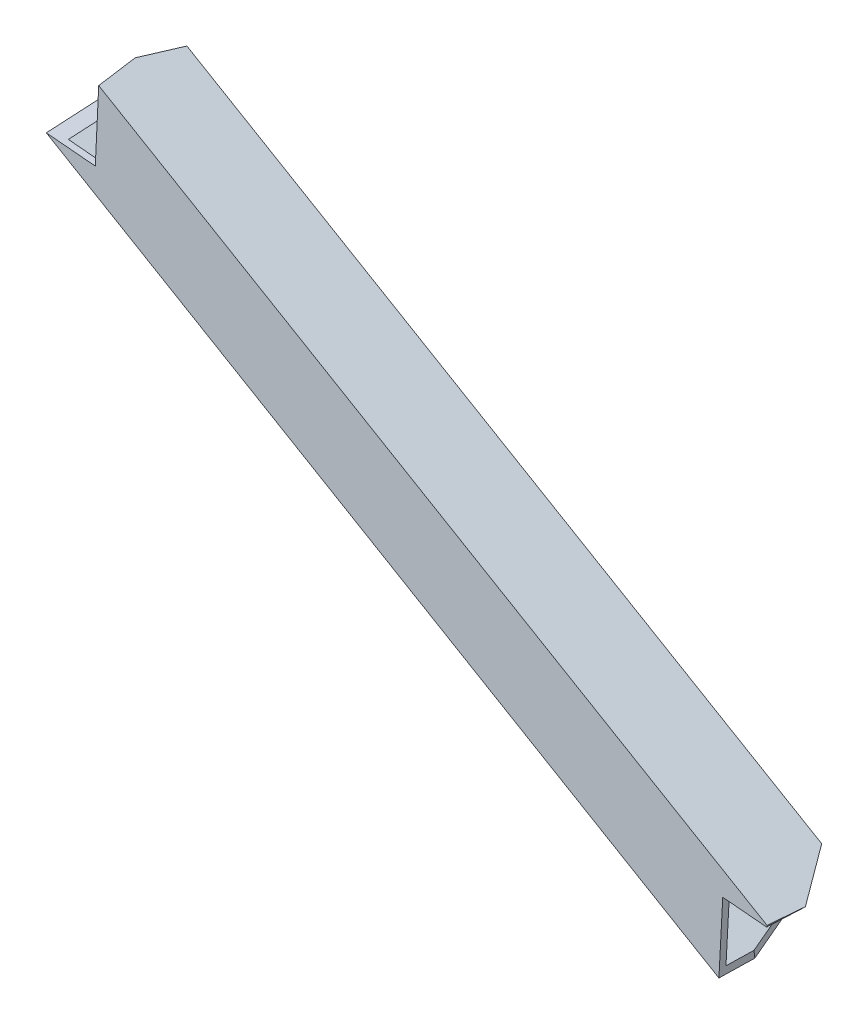
ISO-10303-21;
HEADER;
FILE_DESCRIPTION(('STEP AP214'),'2;1');
FILE_NAME('part.step','',(''),(''),'','','');
FILE_SCHEMA(('AUTOMOTIVE_DESIGN { 1 0 10303 214 1 1 1 1 }'));
ENDSEC;
DATA;
#1=APPLICATION_CONTEXT('core data for automotive mechanical design processes');
#2=APPLICATION_PROTOCOL_DEFINITION('international standard','automotive_design',2000,#1);
#3=PRODUCT_CONTEXT('',#1,'mechanical');
#4=PRODUCT('Part','Part','',(#3));
#5=PRODUCT_RELATED_PRODUCT_CATEGORY('part','',(#4));
#6=PRODUCT_DEFINITION_FORMATION('','',#4);
#7=PRODUCT_DEFINITION_CONTEXT('part definition',#1,'design');
#8=PRODUCT_DEFINITION('design','',#6,#7);
#9=PRODUCT_DEFINITION_SHAPE('','',#8);
#10=(LENGTH_UNIT() NAMED_UNIT(*) SI_UNIT(.MILLI.,.METRE.));
#11=(NAMED_UNIT(*) PLANE_ANGLE_UNIT() SI_UNIT($,.RADIAN.));
#12=(NAMED_UNIT(*) SI_UNIT($,.STERADIAN.) SOLID_ANGLE_UNIT());
#13=UNCERTAINTY_MEASURE_WITH_UNIT(LENGTH_MEASURE(1.E-05),#10,'distance_accuracy_value','');
#14=(GEOMETRIC_REPRESENTATION_CONTEXT(3) GLOBAL_UNCERTAINTY_ASSIGNED_CONTEXT((#13)) GLOBAL_UNIT_ASSIGNED_CONTEXT((#10,
#11,#12)) REPRESENTATION_CONTEXT('',''));
#15=CARTESIAN_POINT('',(0.,0.,0.));
#16=DIRECTION('',(0.,0.,1.));
#17=DIRECTION('',(1.,0.,0.));
#18=AXIS2_PLACEMENT_3D('',#15,#16,#17);
#19=CARTESIAN_POINT('',(-63.0871154005148,-89.7690510930017,-1689.74860806712));
#20=DIRECTION('',(0.389788086231143,0.920681692103509,-0.0202600507818227));
#21=DIRECTION('',(-0.920870706243423,0.389868108958324,0.));
#22=AXIS2_PLACEMENT_3D('',#19,#20,#21);
#23=PLANE('',#22);
#24=DIRECTION('',(0.0519070217012584,0.,0.99865192189176));
#25=VECTOR('',#24,1.);
#26=CARTESIAN_POINT('',(-250.99441719747,-10.,-1679.98173316467));
#27=LINE('',#26,#25);
#28=CARTESIAN_POINT('',(-252.538611746394,-10.,-1709.69087084037));
#29=VERTEX_POINT('',#28);
#30=CARTESIAN_POINT('',(-251.489530353145,-9.99999999999999,-1689.50733660452));
#31=VERTEX_POINT('',#30);
#32=EDGE_CURVE('E11',#29,#31,#27,.T.);
#33=ORIENTED_EDGE('',*,*,#32,.F.);
#34=DIRECTION('',(-0.917328644212009,0.386243639668214,-0.0965609099170536));
#35=VECTOR('',#34,1.);
#36=CARTESIAN_POINT('',(-63.0871154005148,-89.7690510930017,-1689.74860806712));
#37=LINE('',#36,#35);
#38=CARTESIAN_POINT('',(-74.1970478620124,-85.0911847934237,-1690.91807464201));
#39=VERTEX_POINT('',#38);
#40=EDGE_CURVE('E109',#39,#29,#37,.T.);
#41=ORIENTED_EDGE('',*,*,#40,.F.);
#42=DIRECTION('',(-0.331543273132427,0.119772265723642,-0.935806423574909));
#43=VECTOR('',#42,1.);
#44=CARTESIAN_POINT('',(-72.4272379255188,-85.7305406880294,-1685.92264978712));
#45=LINE('',#44,#43);
#46=CARTESIAN_POINT('',(-70.0000000000002,-86.6073969217361,-1679.07158379871));
#47=VERTEX_POINT('',#46);
#48=EDGE_CURVE('E293',#47,#39,#45,.T.);
#49=ORIENTED_EDGE('',*,*,#48,.F.);
#50=DIRECTION('',(0.,-0.0220001628763165,-0.999757967126752));
#51=VECTOR('',#50,1.);
#52=CARTESIAN_POINT('',(-70.0000000000002,-86.8437666053328,-1689.81298038252));
#53=LINE('',#52,#51);
#54=CARTESIAN_POINT('',(-70.0000000000002,-86.416644359219,-1670.40317551471));
#55=VERTEX_POINT('',#54);
#56=EDGE_CURVE('E167',#55,#47,#53,.T.);
#57=ORIENTED_EDGE('',*,*,#56,.F.);
#58=DIRECTION('',(-0.917328644212009,0.386243639668214,-0.0965609099170536));
#59=VECTOR('',#58,1.);
#60=CARTESIAN_POINT('',(-64.7086463241079,-88.6445827490684,-1669.84619091725));
#61=LINE('',#60,#59);
#62=EDGE_CURVE('E45',#55,#31,#61,.T.);
#63=ORIENTED_EDGE('',*,*,#62,.T.);
#64=EDGE_LOOP('',(#33,#41,#49,#57,#63));
#65=FACE_BOUND('',#64,.T.);
#66=ADVANCED_FACE('F41',(#65),#23,.F.);
#67=CARTESIAN_POINT('',(-56.9128845994852,-70.2309489069982,-1670.25139193288));
#68=DIRECTION('',(0.0810765461796534,-0.056223417196662,-0.995120857493354));
#69=DIRECTION('',(-0.996697420861703,0.,-0.0812049952135336));
#70=AXIS2_PLACEMENT_3D('',#67,#68,#69);
#71=PLANE('',#70);
#72=DIRECTION('',(-0.00650701564536868,0.998356602920274,-0.056936386896976));
#73=VECTOR('',#72,1.);
#74=CARTESIAN_POINT('',(-238.210154803049,-72.2484874476755,-1684.90842929572));
#75=LINE('',#74,#73);
#76=CARTESIAN_POINT('',(-238.615873441598,-10.,-1688.45846738302));
#77=VERTEX_POINT('',#76);
#78=CARTESIAN_POINT('',(-238.722245095367,6.32036077547827,-1689.3892193535));
#79=VERTEX_POINT('',#78);
#80=EDGE_CURVE('E103',#77,#79,#75,.T.);
#81=ORIENTED_EDGE('',*,*,#80,.F.);
#82=DIRECTION('',(0.996697420861703,0.,0.0812049952135336));
#83=VECTOR('',#82,1.);
#84=CARTESIAN_POINT('',(-56.6374571669114,-10.,-1673.63194519761));
#85=LINE('',#84,#83);
#86=EDGE_CURVE('E128',#31,#77,#85,.T.);
#87=ORIENTED_EDGE('',*,*,#86,.F.);
#88=ORIENTED_EDGE('',*,*,#62,.F.);
#89=DIRECTION('',(0.,-0.998407737776047,0.0564091229227733));
#90=VECTOR('',#89,1.);
#91=CARTESIAN_POINT('',(-70.0000000000002,-70.2909999601044,-1671.31425965669));
#92=LINE('',#91,#90);
#93=CARTESIAN_POINT('',(-70.0000000000002,-69.9999999999998,-1671.33070088796));
#94=VERTEX_POINT('',#93);
#95=EDGE_CURVE('E173',#94,#55,#92,.T.);
#96=ORIENTED_EDGE('',*,*,#95,.F.);
#97=DIRECTION('',(-0.996697420861703,0.,-0.0812049952135336));
#98=VECTOR('',#97,1.);
#99=CARTESIAN_POINT('',(-56.9118285034804,-69.9999999999998,-1670.26435429021));
#100=LINE('',#99,#98);
#101=CARTESIAN_POINT('',(-58.4694290318394,-69.9999999999998,-1670.39125834434));
#102=VERTEX_POINT('',#101);
#103=EDGE_CURVE('E247',#102,#94,#100,.T.);
#104=ORIENTED_EDGE('',*,*,#103,.F.);
#105=DIRECTION('',(-0.199222248814033,-0.97917434035687,0.0390910061800458));
#106=VECTOR('',#105,1.);
#107=CARTESIAN_POINT('',(-58.4537917747577,-69.9231431179037,-1670.39432665682));
#108=LINE('',#107,#106);
#109=CARTESIAN_POINT('',(-58.389887195482,-69.6090530771048,-1670.40686589036));
#110=VERTEX_POINT('',#109);
#111=EDGE_CURVE('E254',#110,#102,#108,.T.);
#112=ORIENTED_EDGE('',*,*,#111,.F.);
#113=DIRECTION('',(-0.917328644212009,0.386243639668214,-0.0965609099170536));
#114=VECTOR('',#113,1.);
#115=CARTESIAN_POINT('',(-56.9128845994852,-70.2309489069982,-1670.25139193288));
#116=LINE('',#115,#114);
#117=EDGE_CURVE('E152',#110,#79,#116,.T.);
#118=ORIENTED_EDGE('',*,*,#117,.T.);
#119=EDGE_LOOP('',(#81,#87,#88,#96,#104,#112,#118));
#120=FACE_BOUND('',#119,.T.);
#121=ADVANCED_FACE('F169',(#120),#71,.F.);
#122=CARTESIAN_POINT('',(-55.2913536758921,-71.3554172509315,-1690.15380908275));
#123=DIRECTION('',(-0.389788086231143,-0.920681692103509,0.0202600507818227));
#124=DIRECTION('',(0.920870706243423,-0.389868108958324,0.));
#125=AXIS2_PLACEMENT_3D('',#122,#123,#124);
#126=PLANE('',#125);
#127=DIRECTION('',(-0.113507613195636,0.0261999374612772,-0.993191615461818));
#128=VECTOR('',#127,1.);
#129=CARTESIAN_POINT('',(-236.214121953579,5.74143335721979,-1667.44314186286));
#130=LINE('',#129,#128);
#131=CARTESIAN_POINT('',(-239.858774037238,6.58269548908574,-1699.33384759487));
#132=VERTEX_POINT('',#131);
#133=EDGE_CURVE('E119',#79,#132,#130,.T.);
#134=ORIENTED_EDGE('',*,*,#133,.F.);
#135=ORIENTED_EDGE('',*,*,#117,.F.);
#136=DIRECTION('',(-0.0422484460755079,0.039855023737651,0.998311898099525));
#137=VECTOR('',#136,1.);
#138=CARTESIAN_POINT('',(-57.5485466570465,-70.4027307207954,-1690.28736678198));
#139=LINE('',#138,#137);
#140=CARTESIAN_POINT('',(-58.0135824280842,-69.9640397530746,-1679.29877935703));
#141=VERTEX_POINT('',#140);
#142=EDGE_CURVE('E260',#141,#110,#139,.T.);
#143=ORIENTED_EDGE('',*,*,#142,.F.);
#144=DIRECTION('',(0.5451826238665,-0.212971064645943,0.810813931958259));
#145=VECTOR('',#144,1.);
#146=CARTESIAN_POINT('',(-61.8412956585872,-68.4687753661099,-1684.99148319418));
#147=LINE('',#146,#145);
#148=CARTESIAN_POINT('',(-66.0756795254059,-66.8146484721888,-1691.28900127744));
#149=VERTEX_POINT('',#148);
#150=EDGE_CURVE('E271',#149,#141,#147,.T.);
#151=ORIENTED_EDGE('',*,*,#150,.F.);
#152=DIRECTION('',(-0.917328644212009,0.386243639668214,-0.0965609099170536));
#153=VECTOR('',#152,1.);
#154=CARTESIAN_POINT('',(-55.2913536758921,-71.3554172509315,-1690.15380908275));
#155=LINE('',#154,#153);
#156=CARTESIAN_POINT('',(-237.362439306566,5.30609248829959,-1709.31918651756));
#157=VERTEX_POINT('',#156);
#158=EDGE_CURVE('E112',#149,#157,#155,.T.);
#159=ORIENTED_EDGE('',*,*,#158,.T.);
#160=DIRECTION('',(0.240691344665425,-0.123087376499567,-0.962765378661698));
#161=VECTOR('',#160,1.);
#162=CARTESIAN_POINT('',(-228.98463870736,1.02176104287016,-1742.83038891438));
#163=LINE('',#162,#161);
#164=EDGE_CURVE('E270',#132,#157,#163,.T.);
#165=ORIENTED_EDGE('',*,*,#164,.F.);
#166=EDGE_LOOP('',(#134,#135,#143,#151,#159,#165));
#167=FACE_BOUND('',#166,.T.);
#168=ADVANCED_FACE('F323',(#167),#126,.F.);
#169=CARTESIAN_POINT('',(-55.2913536758921,-71.3554172509315,-1690.15380908275));
#170=DIRECTION('',(-0.0810765461796534,0.056223417196662,0.995120857493354));
#171=DIRECTION('',(0.996697420861703,0.,0.0812049952135336));
#172=AXIS2_PLACEMENT_3D('',#169,#170,#171);
#173=PLANE('',#172);
#174=DIRECTION('',(-0.996697420861703,0.,-0.0812049952135336));
#175=VECTOR('',#174,1.);
#176=CARTESIAN_POINT('',(-55.010784211944,-10.,-1693.59747483699));
#177=LINE('',#176,#175);
#178=CARTESIAN_POINT('',(-237.574318690023,-10.,-1708.47166898373));
#179=VERTEX_POINT('',#178);
#180=EDGE_CURVE('E51',#179,#29,#177,.T.);
#181=ORIENTED_EDGE('',*,*,#180,.F.);
#182=DIRECTION('',(-0.0138203212509284,-0.998375169086681,0.0552812850037135));
#183=VECTOR('',#182,1.);
#184=CARTESIAN_POINT('',(-238.400071148149,-69.6520685038425,-1705.16865915123));
#185=LINE('',#184,#183);
#186=EDGE_CURVE('E102',#157,#179,#185,.T.);
#187=ORIENTED_EDGE('',*,*,#186,.F.);
#188=ORIENTED_EDGE('',*,*,#158,.F.);
#189=DIRECTION('',(0.994614005315425,-0.0601185166345809,0.0844318920080898));
#190=VECTOR('',#189,1.);
#191=CARTESIAN_POINT('',(-55.0403652895334,-67.4816677569683,-1690.35222333659));
#192=LINE('',#191,#190);
#193=CARTESIAN_POINT('',(-75.3880820949328,-66.2517689774382,-1692.07952279019));
#194=VERTEX_POINT('',#193);
#195=EDGE_CURVE('E273',#194,#149,#192,.T.);
#196=ORIENTED_EDGE('',*,*,#195,.F.);
#197=DIRECTION('',(-0.0629752890348987,0.996123892552847,-0.061410940852061));
#198=VECTOR('',#197,1.);
#199=CARTESIAN_POINT('',(-74.9807753597959,-72.6944225433909,-1691.68233382602));
#200=LINE('',#199,#198);
#201=EDGE_CURVE('E290',#39,#194,#200,.T.);
#202=ORIENTED_EDGE('',*,*,#201,.F.);
#203=ORIENTED_EDGE('',*,*,#40,.T.);
#204=EDGE_LOOP('',(#181,#187,#188,#196,#202,#203));
#205=FACE_BOUND('',#204,.T.);
#206=ADVANCED_FACE('F320',(#205),#173,.F.);
#207=CARTESIAN_POINT('',(-56.0447370877494,-72.7385504907824,-1688.52919962951));
#208=DIRECTION('',(-0.081076546179654,0.0562234171966604,0.995120857493354));
#209=DIRECTION('',(0.996697420861703,0.,0.0812049952135342));
#210=AXIS2_PLACEMENT_3D('',#207,#208,#209);
#211=PLANE('',#210);
#212=DIRECTION('',(-0.013820321250928,-0.998375169086681,0.055281285003712));
#213=VECTOR('',#212,1.);
#214=CARTESIAN_POINT('',(-238.81319872597,-71.0383669362445,-1703.51614883994));
#215=LINE('',#214,#213);
#216=CARTESIAN_POINT('',(-237.777495030095,3.78050548494219,-1707.65896362344));
#217=VERTEX_POINT('',#216);
#218=CARTESIAN_POINT('',(-237.968255997214,-10.,-1706.89591975497));
#219=VERTEX_POINT('',#218);
#220=EDGE_CURVE('E91',#217,#219,#215,.T.);
#221=ORIENTED_EDGE('',*,*,#220,.T.);
#222=DIRECTION('',(-0.996697420861703,0.,-0.0812049952135342));
#223=VECTOR('',#222,1.);
#224=CARTESIAN_POINT('',(-55.7578427552069,-10.,-1692.05049583245));
#225=LINE('',#224,#223);
#226=CARTESIAN_POINT('',(-248.33243386697,-10.,-1707.74033150591));
#227=VERTEX_POINT('',#226);
#228=EDGE_CURVE('E78',#219,#227,#225,.T.);
#229=ORIENTED_EDGE('',*,*,#228,.T.);
#230=DIRECTION('',(-0.917328644212009,0.386243639668214,-0.0965609099170536));
#231=VECTOR('',#230,1.);
#232=CARTESIAN_POINT('',(-62.5931769364322,-88.2060029181212,-1688.18883077638));
#233=LINE('',#232,#231);
#234=CARTESIAN_POINT('',(-73.7188102055264,-83.5215257521868,-1689.35995006786));
#235=VERTEX_POINT('',#234);
#236=EDGE_CURVE('E141',#235,#227,#233,.T.);
#237=ORIENTED_EDGE('',*,*,#236,.F.);
#238=DIRECTION('',(-0.0629752890348982,0.996123892552847,-0.0614109408520595));
#239=VECTOR('',#238,1.);
#240=CARTESIAN_POINT('',(-74.3219328778287,-73.9815154842255,-1689.94809077071));
#241=LINE('',#240,#239);
#242=CARTESIAN_POINT('',(-74.7840448905734,-66.6719687717751,-1690.39872361284));
#243=VERTEX_POINT('',#242);
#244=EDGE_CURVE('E90',#235,#243,#241,.T.);
#245=ORIENTED_EDGE('',*,*,#244,.T.);
#246=DIRECTION('',(0.994614005315425,-0.060118516634581,0.0844318920080903));
#247=VECTOR('',#246,1.);
#248=CARTESIAN_POINT('',(-55.7263062763036,-67.8238960217197,-1688.78092925242));
#249=LINE('',#248,#247);
#250=CARTESIAN_POINT('',(-69.7268905968333,-66.9776437501155,-1689.96942631468));
#251=VERTEX_POINT('',#250);
#252=EDGE_CURVE('E149',#243,#251,#249,.T.);
#253=ORIENTED_EDGE('',*,*,#252,.T.);
#254=DIRECTION('',(-0.917328644212009,0.386243639668214,-0.0965609099170536));
#255=VECTOR('',#254,1.);
#256=CARTESIAN_POINT('',(-56.0447370877494,-72.7385504907824,-1688.52919962951));
#257=LINE('',#256,#255);
#258=EDGE_CURVE('E108',#251,#217,#257,.T.);
#259=ORIENTED_EDGE('',*,*,#258,.T.);
#260=EDGE_LOOP('',(#221,#229,#237,#245,#253,#259));
#261=FACE_BOUND('',#260,.T.);
#262=ADVANCED_FACE('F43',(#261),#211,.T.);
#263=CARTESIAN_POINT('',(-56.0447370877494,-72.7385504907824,-1688.52919962951));
#264=DIRECTION('',(-0.389788086231143,-0.920681692103509,0.0202600507818227));
#265=DIRECTION('',(0.920870706243423,-0.389868108958324,0.));
#266=AXIS2_PLACEMENT_3D('',#263,#264,#265);
#267=PLANE('',#266);
#268=DIRECTION('',(-0.917328644212009,0.386243639668214,-0.0965609099170536));
#269=VECTOR('',#268,1.);
#270=CARTESIAN_POINT('',(-57.4068230635673,-71.7939970818785,-1671.81116922362));
#271=LINE('',#270,#269);
#272=CARTESIAN_POINT('',(-61.6675661330291,-69.9999999999998,-1672.25966849409));
#273=VERTEX_POINT('',#272);
#274=CARTESIAN_POINT('',(-238.896661482556,4.62277698927478,-1690.91536274141));
#275=VERTEX_POINT('',#274);
#276=EDGE_CURVE('E127',#273,#275,#271,.T.);
#277=ORIENTED_EDGE('',*,*,#276,.T.);
#278=DIRECTION('',(-0.113507613195636,0.0261999374612772,-0.993191615461818));
#279=VECTOR('',#278,1.);
#280=CARTESIAN_POINT('',(-236.041733359391,3.9637997085662,-1665.93474166371));
#281=LINE('',#280,#279);
#282=CARTESIAN_POINT('',(-239.858774037238,4.84485274308265,-1699.33384759487));
#283=VERTEX_POINT('',#282);
#284=EDGE_CURVE('E123',#275,#283,#281,.T.);
#285=ORIENTED_EDGE('',*,*,#284,.T.);
#286=DIRECTION('',(0.240691344665425,-0.123087376499567,-0.962765378661698));
#287=VECTOR('',#286,1.);
#288=CARTESIAN_POINT('',(-229.41526220707,-0.495864740566232,-1741.10789491555));
#289=LINE('',#288,#287);
#290=EDGE_CURVE('E126',#283,#217,#289,.T.);
#291=ORIENTED_EDGE('',*,*,#290,.T.);
#292=ORIENTED_EDGE('',*,*,#258,.F.);
#293=DIRECTION('',(0.5451826238665,-0.212971064645943,0.810813931958259));
#294=VECTOR('',#293,1.);
#295=CARTESIAN_POINT('',(-64.3546966469618,-69.0762467042492,-1681.97971881291));
#296=LINE('',#295,#294);
#297=CARTESIAN_POINT('',(-61.9899892796963,-69.9999999999998,-1678.46284649445));
#298=VERTEX_POINT('',#297);
#299=EDGE_CURVE('E207',#251,#298,#296,.T.);
#300=ORIENTED_EDGE('',*,*,#299,.T.);
#301=DIRECTION('',(0.0519070217012584,0.,0.99865192189176));
#302=VECTOR('',#301,1.);
#303=CARTESIAN_POINT('',(-62.4957807758298,-69.9999999999998,-1688.19389314547));
#304=LINE('',#303,#302);
#305=EDGE_CURVE('E136',#298,#273,#304,.T.);
#306=ORIENTED_EDGE('',*,*,#305,.T.);
#307=EDGE_LOOP('',(#277,#285,#291,#292,#300,#306));
#308=FACE_BOUND('',#307,.T.);
#309=ADVANCED_FACE('F213',(#308),#267,.T.);
#310=CARTESIAN_POINT('',(-57.4068230635673,-71.7939970818785,-1671.81116922362));
#311=DIRECTION('',(0.0810765461796534,-0.056223417196662,-0.995120857493354));
#312=DIRECTION('',(-0.996697420861703,0.,-0.0812049952135336));
#313=AXIS2_PLACEMENT_3D('',#310,#311,#312);
#314=PLANE('',#313);
#315=DIRECTION('',(0.996697420861703,0.,0.0812049952135336));
#316=VECTOR('',#315,1.);
#317=CARTESIAN_POINT('',(-57.1242480373791,-10.,-1675.27945093537));
#318=LINE('',#317,#316);
#319=CARTESIAN_POINT('',(-247.451205496642,-10.0000000000001,-1690.78616274779));
#320=VERTEX_POINT('',#319);
#321=CARTESIAN_POINT('',(-238.801354216225,-10.,-1690.08142416101));
#322=VERTEX_POINT('',#321);
#323=EDGE_CURVE('E132',#320,#322,#318,.T.);
#324=ORIENTED_EDGE('',*,*,#323,.T.);
#325=DIRECTION('',(-0.00650701564536868,0.998356602920274,-0.056936386896976));
#326=VECTOR('',#325,1.);
#327=CARTESIAN_POINT('',(-238.385471166749,-73.8079898859503,-1686.4424474781));
#328=LINE('',#327,#326);
#329=EDGE_CURVE('E135',#322,#275,#328,.T.);
#330=ORIENTED_EDGE('',*,*,#329,.T.);
#331=ORIENTED_EDGE('',*,*,#276,.F.);
#332=DIRECTION('',(-0.996697420861703,0.,-0.0812049952135336));
#333=VECTOR('',#332,1.);
#334=CARTESIAN_POINT('',(-57.3986193739481,-69.9999999999998,-1671.91186002797));
#335=LINE('',#334,#333);
#336=CARTESIAN_POINT('',(-70.0000000000002,-69.9999999999998,-1672.93854579238));
#337=VERTEX_POINT('',#336);
#338=EDGE_CURVE('E224',#273,#337,#335,.T.);
#339=ORIENTED_EDGE('',*,*,#338,.T.);
#340=DIRECTION('',(0.,-0.998407737776047,0.0564091229227733));
#341=VECTOR('',#340,1.);
#342=CARTESIAN_POINT('',(-70.0000000000002,-71.8517816672392,-1672.83392182389));
#343=LINE('',#342,#341);
#344=CARTESIAN_POINT('',(-70.0000000000002,-84.7162970512174,-1672.10708848499));
#345=VERTEX_POINT('',#344);
#346=EDGE_CURVE('E146',#337,#345,#343,.T.);
#347=ORIENTED_EDGE('',*,*,#346,.T.);
#348=DIRECTION('',(-0.917328644212009,0.386243639668214,-0.0965609099170536));
#349=VECTOR('',#348,1.);
#350=CARTESIAN_POINT('',(-63.9552629122506,-87.2614495092173,-1671.47080037049));
#351=LINE('',#350,#349);
#352=EDGE_CURVE('E143',#345,#320,#351,.T.);
#353=ORIENTED_EDGE('',*,*,#352,.T.);
#354=EDGE_LOOP('',(#324,#330,#331,#339,#347,#353));
#355=FACE_BOUND('',#354,.T.);
#356=ADVANCED_FACE('F221',(#355),#314,.T.);
#357=CARTESIAN_POINT('',(-62.5931769364322,-88.2060029181212,-1688.18883077638));
#358=DIRECTION('',(0.389788086231143,0.920681692103509,-0.0202600507818227));
#359=DIRECTION('',(-0.920870706243423,0.389868108958324,0.));
#360=AXIS2_PLACEMENT_3D('',#357,#358,#359);
#361=PLANE('',#360);
#362=ORIENTED_EDGE('',*,*,#236,.T.);
#363=DIRECTION('',(0.0519070217012584,0.,0.99865192189176));
#364=VECTOR('',#363,1.);
#365=CARTESIAN_POINT('',(-246.818497299535,-10.,-1678.61333455754));
#366=LINE('',#365,#364);
#367=EDGE_CURVE('E85',#227,#320,#366,.T.);
#368=ORIENTED_EDGE('',*,*,#367,.T.);
#369=ORIENTED_EDGE('',*,*,#352,.F.);
#370=DIRECTION('',(0.,-0.0220001628763165,-0.999757967126752));
#371=VECTOR('',#370,1.);
#372=CARTESIAN_POINT('',(-70.0000000000002,-85.0717014121513,-1688.25780261346));
#373=LINE('',#372,#371);
#374=CARTESIAN_POINT('',(-70.0000000000002,-84.8649712695814,-1678.86332184341));
#375=VERTEX_POINT('',#374);
#376=EDGE_CURVE('E262',#345,#375,#373,.T.);
#377=ORIENTED_EDGE('',*,*,#376,.T.);
#378=DIRECTION('',(-0.331543273132427,0.119772265723642,-0.935806423574909));
#379=VECTOR('',#378,1.);
#380=CARTESIAN_POINT('',(-71.9464991336396,-84.1617851989897,-1684.35746556569));
#381=LINE('',#380,#379);
#382=EDGE_CURVE('E240',#375,#235,#381,.T.);
#383=ORIENTED_EDGE('',*,*,#382,.T.);
#384=EDGE_LOOP('',(#362,#368,#369,#377,#383));
#385=FACE_BOUND('',#384,.T.);
#386=ADVANCED_FACE('F304',(#385),#361,.T.);
#387=CARTESIAN_POINT('',(-60.,-80.,-1680.));
#388=DIRECTION('',(0.979114049590753,-0.197241393803742,0.0493103484509357));
#389=DIRECTION('',(0.197481629250392,0.980306587812512,0.));
#390=AXIS2_PLACEMENT_3D('',#387,#388,#389);
#391=PLANE('',#390);
#392=ORIENTED_EDGE('',*,*,#111,.T.);
#393=DIRECTION('',(0.0502984641771046,0.,-0.998734231165341));
#394=VECTOR('',#393,1.);
#395=CARTESIAN_POINT('',(-57.9906080820512,-69.9999999999998,-1679.89880258006));
#396=LINE('',#395,#394);
#397=CARTESIAN_POINT('',(-58.0286483947006,-69.9999999999998,-1679.14346813737));
#398=VERTEX_POINT('',#397);
#399=EDGE_CURVE('E245',#102,#398,#396,.T.);
#400=ORIENTED_EDGE('',*,*,#399,.T.);
#401=DIRECTION('',(0.0940856984357503,0.224568727252764,-0.969905545963075));
#402=VECTOR('',#401,1.);
#403=CARTESIAN_POINT('',(-58.179223923749,-70.3594016463287,-1677.59122328891));
#404=LINE('',#403,#402);
#405=EDGE_CURVE('E253',#398,#141,#404,.T.);
#406=ORIENTED_EDGE('',*,*,#405,.T.);
#407=ORIENTED_EDGE('',*,*,#142,.T.);
#408=EDGE_LOOP('',(#392,#400,#406,#407));
#409=FACE_BOUND('',#408,.T.);
#410=ADVANCED_FACE('F258',(#409),#391,.T.);
#411=CARTESIAN_POINT('',(-70.0000000000002,-89.9999999999998,-1085.));
#412=DIRECTION('',(1.,0.,0.));
#413=DIRECTION('',(0.,0.,-1.));
#414=AXIS2_PLACEMENT_3D('',#411,#412,#413);
#415=PLANE('',#414);
#416=ORIENTED_EDGE('',*,*,#56,.T.);
#417=DIRECTION('',(0.,0.992932622114171,0.118679433523578));
#418=VECTOR('',#417,1.);
#419=CARTESIAN_POINT('',(-70.0000000000002,-19.9464157685872,-1671.10398629492));
#420=LINE('',#419,#418);
#421=EDGE_CURVE('E295',#47,#375,#420,.T.);
#422=ORIENTED_EDGE('',*,*,#421,.T.);
#423=ORIENTED_EDGE('',*,*,#376,.F.);
#424=ORIENTED_EDGE('',*,*,#346,.F.);
#425=DIRECTION('',(0.,0.,-1.));
#426=VECTOR('',#425,1.);
#427=CARTESIAN_POINT('',(-70.0000000000002,-69.9999999999998,-1085.));
#428=LINE('',#427,#426);
#429=EDGE_CURVE('E256',#94,#337,#428,.T.);
#430=ORIENTED_EDGE('',*,*,#429,.F.);
#431=ORIENTED_EDGE('',*,*,#95,.T.);
#432=EDGE_LOOP('',(#416,#422,#423,#424,#430,#431));
#433=FACE_BOUND('',#432,.T.);
#434=ADVANCED_FACE('F306',(#433),#415,.T.);
#435=CARTESIAN_POINT('',(-69.8278499414046,-90.1197565625013,-1678.99805556793));
#436=DIRECTION('',(0.94343640931858,0.0393485848218569,-0.3292103133934));
#437=DIRECTION('',(-0.329465469723453,0.,-0.944167625085665));
#438=AXIS2_PLACEMENT_3D('',#435,#436,#437);
#439=PLANE('',#438);
#440=ORIENTED_EDGE('',*,*,#48,.T.);
#441=ORIENTED_EDGE('',*,*,#201,.T.);
#442=DIRECTION('',(-0.329210313393401,0.229015870186713,-0.916063480746854));
#443=VECTOR('',#442,1.);
#444=CARTESIAN_POINT('',(-69.0408782449674,-70.6672151339358,-1674.4177381642));
#445=LINE('',#444,#443);
#446=EDGE_CURVE('E279',#243,#194,#445,.T.);
#447=ORIENTED_EDGE('',*,*,#446,.F.);
#448=ORIENTED_EDGE('',*,*,#244,.F.);
#449=ORIENTED_EDGE('',*,*,#382,.F.);
#450=ORIENTED_EDGE('',*,*,#421,.F.);
#451=EDGE_LOOP('',(#440,#441,#447,#448,#449,#450));
#452=FACE_BOUND('',#451,.T.);
#453=ADVANCED_FACE('F312',(#452),#439,.T.);
#454=CARTESIAN_POINT('',(-50.0000000000002,-69.9999999999998,-1085.));
#455=DIRECTION('',(0.,-1.,0.));
#456=DIRECTION('',(0.,0.,-1.));
#457=AXIS2_PLACEMENT_3D('',#454,#455,#456);
#458=PLANE('',#457);
#459=DIRECTION('',(0.985558600813723,0.,-0.169334711037329));
#460=VECTOR('',#459,1.);
#461=CARTESIAN_POINT('',(-149.386391562455,-69.9999999999998,-1663.44674850288));
#462=LINE('',#461,#460);
#463=EDGE_CURVE('E249',#298,#398,#462,.T.);
#464=ORIENTED_EDGE('',*,*,#463,.T.);
#465=ORIENTED_EDGE('',*,*,#399,.F.);
#466=ORIENTED_EDGE('',*,*,#103,.T.);
#467=ORIENTED_EDGE('',*,*,#429,.T.);
#468=ORIENTED_EDGE('',*,*,#338,.F.);
#469=ORIENTED_EDGE('',*,*,#305,.F.);
#470=EDGE_LOOP('',(#464,#465,#466,#467,#468,#469));
#471=FACE_BOUND('',#470,.T.);
#472=ADVANCED_FACE('F246',(#471),#458,.T.);
#473=CARTESIAN_POINT('',(-50.1721500585959,-69.8802434374987,-1681.00194443207));
#474=DIRECTION('',(-0.0393485848218571,-0.972627071428274,-0.229015870186713));
#475=DIRECTION('',(0.,0.229193370242402,-0.973380911584426));
#476=AXIS2_PLACEMENT_3D('',#473,#474,#475);
#477=PLANE('',#476);
#478=ORIENTED_EDGE('',*,*,#446,.T.);
#479=ORIENTED_EDGE('',*,*,#195,.T.);
#480=ORIENTED_EDGE('',*,*,#150,.T.);
#481=ORIENTED_EDGE('',*,*,#405,.F.);
#482=ORIENTED_EDGE('',*,*,#463,.F.);
#483=ORIENTED_EDGE('',*,*,#299,.F.);
#484=ORIENTED_EDGE('',*,*,#252,.F.);
#485=EDGE_LOOP('',(#478,#479,#480,#481,#482,#483,#484));
#486=FACE_BOUND('',#485,.T.);
#487=ADVANCED_FACE('F315',(#486),#477,.T.);
#488=CARTESIAN_POINT('',(-165.298574998547,-10.,-1997.57464374964));
#489=DIRECTION('',(-0.970142500145332,0.,-0.242535625036333));
#490=DIRECTION('',(-0.242535625036333,0.,0.970142500145332));
#491=AXIS2_PLACEMENT_3D('',#488,#489,#490);
#492=PLANE('',#491);
#493=ORIENTED_EDGE('',*,*,#164,.T.);
#494=ORIENTED_EDGE('',*,*,#186,.T.);
#495=DIRECTION('',(-0.242535625036333,0.,0.970142500145332));
#496=VECTOR('',#495,1.);
#497=CARTESIAN_POINT('',(-165.298574998547,-10.,-1997.57464374964));
#498=LINE('',#497,#496);
#499=EDGE_CURVE('E81',#179,#219,#498,.T.);
#500=ORIENTED_EDGE('',*,*,#499,.T.);
#501=ORIENTED_EDGE('',*,*,#220,.F.);
#502=ORIENTED_EDGE('',*,*,#290,.F.);
#503=DIRECTION('',(0.,-1.,0.));
#504=VECTOR('',#503,1.);
#505=CARTESIAN_POINT('',(-239.858774037238,-10.,-1699.33384759487));
#506=LINE('',#505,#504);
#507=EDGE_CURVE('E122',#132,#283,#506,.T.);
#508=ORIENTED_EDGE('',*,*,#507,.F.);
#509=EDGE_LOOP('',(#493,#494,#500,#501,#502,#508));
#510=FACE_BOUND('',#509,.T.);
#511=ADVANCED_FACE('F97',(#510),#492,.T.);
#512=CARTESIAN_POINT('',(-240.064673273436,-10.,-1701.13546591161));
#513=DIRECTION('',(-0.993532672656404,0.,0.113546591160732));
#514=DIRECTION('',(0.113546591160732,0.,0.993532672656404));
#515=AXIS2_PLACEMENT_3D('',#512,#513,#514);
#516=PLANE('',#515);
#517=ORIENTED_EDGE('',*,*,#80,.T.);
#518=ORIENTED_EDGE('',*,*,#133,.T.);
#519=ORIENTED_EDGE('',*,*,#507,.T.);
#520=ORIENTED_EDGE('',*,*,#284,.F.);
#521=ORIENTED_EDGE('',*,*,#329,.F.);
#522=DIRECTION('',(0.113546591160732,0.,0.993532672656404));
#523=VECTOR('',#522,1.);
#524=CARTESIAN_POINT('',(-240.064673273436,-10.,-1701.13546591161));
#525=LINE('',#524,#523);
#526=EDGE_CURVE('E129',#322,#77,#525,.T.);
#527=ORIENTED_EDGE('',*,*,#526,.T.);
#528=EDGE_LOOP('',(#517,#518,#519,#520,#521,#527));
#529=FACE_BOUND('',#528,.T.);
#530=ADVANCED_FACE('F210',(#529),#516,.T.);
#531=CARTESIAN_POINT('',(-259.935326726564,-10.,-1698.86453408839));
#532=DIRECTION('',(0.,1.,0.));
#533=DIRECTION('',(0.,0.,1.));
#534=AXIS2_PLACEMENT_3D('',#531,#532,#533);
#535=PLANE('',#534);
#536=ORIENTED_EDGE('',*,*,#86,.T.);
#537=ORIENTED_EDGE('',*,*,#526,.F.);
#538=ORIENTED_EDGE('',*,*,#323,.F.);
#539=ORIENTED_EDGE('',*,*,#367,.F.);
#540=ORIENTED_EDGE('',*,*,#228,.F.);
#541=ORIENTED_EDGE('',*,*,#499,.F.);
#542=ORIENTED_EDGE('',*,*,#180,.T.);
#543=ORIENTED_EDGE('',*,*,#32,.T.);
#544=EDGE_LOOP('',(#536,#537,#538,#539,#540,#541,#542,#543));
#545=FACE_BOUND('',#544,.T.);
#546=ADVANCED_FACE('F80',(#545),#535,.T.);
#547=CLOSED_SHELL('',(#66,#121,#168,#206,#262,#309,#356,#386,#410,#434,#453,#472,#487,#511,#530,#546));
#548=MANIFOLD_SOLID_BREP('B2',#547);
#549=ADVANCED_BREP_SHAPE_REPRESENTATION('',(#18,#548),#14);
#550=SHAPE_DEFINITION_REPRESENTATION(#9,#549);
ENDSEC;
END-ISO-10303-21;
